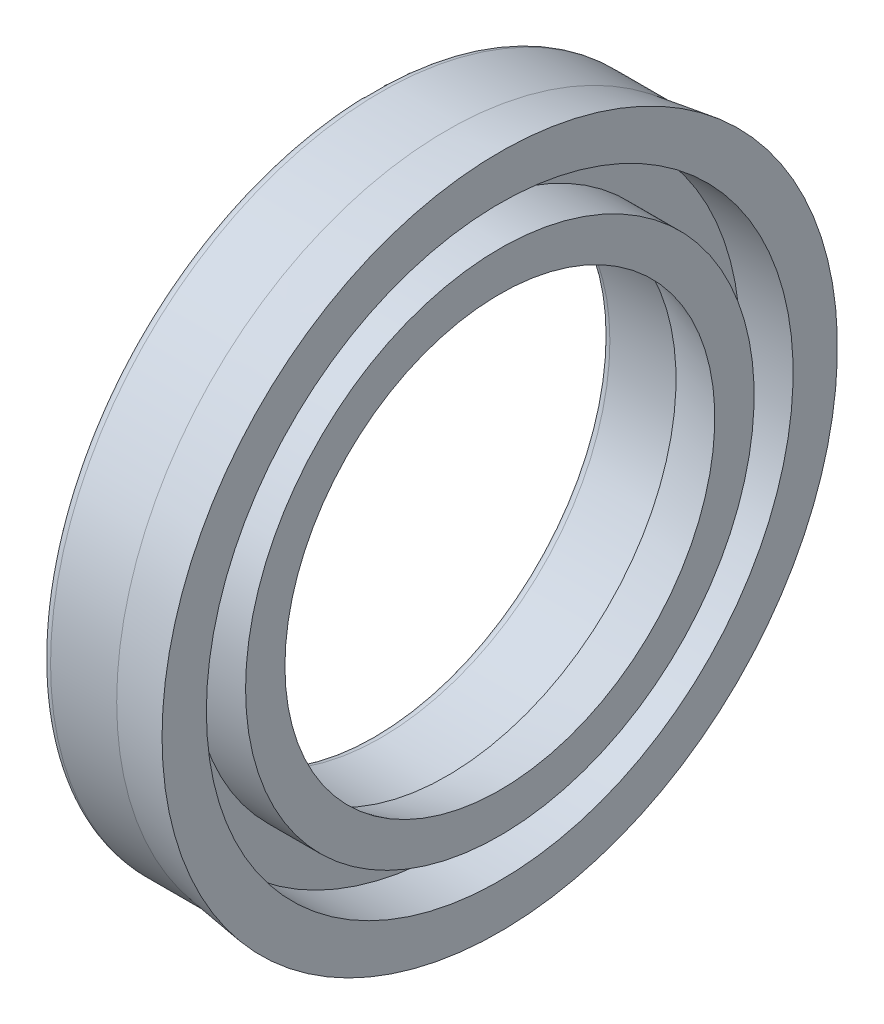
ISO-10303-21;
HEADER;
FILE_DESCRIPTION(('STEP AP214'),'2;1');
FILE_NAME('part.step','',(''),(''),'','','');
FILE_SCHEMA(('AUTOMOTIVE_DESIGN { 1 0 10303 214 1 1 1 1 }'));
ENDSEC;
DATA;
#1=APPLICATION_CONTEXT('core data for automotive mechanical design processes');
#2=APPLICATION_PROTOCOL_DEFINITION('international standard','automotive_design',2000,#1);
#3=PRODUCT_CONTEXT('',#1,'mechanical');
#4=PRODUCT('Part','Part','',(#3));
#5=PRODUCT_RELATED_PRODUCT_CATEGORY('part','',(#4));
#6=PRODUCT_DEFINITION_FORMATION('','',#4);
#7=PRODUCT_DEFINITION_CONTEXT('part definition',#1,'design');
#8=PRODUCT_DEFINITION('design','',#6,#7);
#9=PRODUCT_DEFINITION_SHAPE('','',#8);
#10=(LENGTH_UNIT() NAMED_UNIT(*) SI_UNIT(.MILLI.,.METRE.));
#11=(NAMED_UNIT(*) PLANE_ANGLE_UNIT() SI_UNIT($,.RADIAN.));
#12=(NAMED_UNIT(*) SI_UNIT($,.STERADIAN.) SOLID_ANGLE_UNIT());
#13=UNCERTAINTY_MEASURE_WITH_UNIT(LENGTH_MEASURE(1.E-05),#10,'distance_accuracy_value','');
#14=(GEOMETRIC_REPRESENTATION_CONTEXT(3) GLOBAL_UNCERTAINTY_ASSIGNED_CONTEXT((#13)) GLOBAL_UNIT_ASSIGNED_CONTEXT((#10,
#11,#12)) REPRESENTATION_CONTEXT('',''));
#15=CARTESIAN_POINT('',(0.,0.,0.));
#16=DIRECTION('',(0.,0.,1.));
#17=DIRECTION('',(1.,0.,0.));
#18=AXIS2_PLACEMENT_3D('',#15,#16,#17);
#19=CARTESIAN_POINT('',(0.,0.,0.));
#20=DIRECTION('',(-1.,0.,0.));
#21=DIRECTION('',(0.,0.,1.));
#22=AXIS2_PLACEMENT_3D('',#19,#20,#21);
#23=CYLINDRICAL_SURFACE('',#22,12.5);
#24=CARTESIAN_POINT('',(0.5,0.,0.));
#25=DIRECTION('',(1.,0.,0.));
#26=DIRECTION('',(0.,0.,-1.));
#27=AXIS2_PLACEMENT_3D('',#24,#25,#26);
#28=CIRCLE('',#27,12.5);
#29=CARTESIAN_POINT('',(0.5,0.,-12.5));
#30=VERTEX_POINT('',#29);
#31=EDGE_CURVE('E37',#30,#30,#28,.F.);
#32=ORIENTED_EDGE('',*,*,#31,.T.);
#33=EDGE_LOOP('',(#32));
#34=FACE_BOUND('',#33,.T.);
#35=CARTESIAN_POINT('',(4.10642547441009,0.,0.));
#36=DIRECTION('',(-1.,0.,0.));
#37=DIRECTION('',(0.,0.,1.));
#38=AXIS2_PLACEMENT_3D('',#35,#36,#37);
#39=CIRCLE('',#38,12.5);
#40=CARTESIAN_POINT('',(4.10642547441009,0.,12.5));
#41=VERTEX_POINT('',#40);
#42=EDGE_CURVE('E50',#41,#41,#39,.T.);
#43=ORIENTED_EDGE('',*,*,#42,.F.);
#44=EDGE_LOOP('',(#43));
#45=FACE_BOUND('',#44,.T.);
#46=ADVANCED_FACE('F30',(#34,#45),#23,.F.);
#47=CARTESIAN_POINT('',(4.10642547441009,0.,0.));
#48=DIRECTION('',(-1.,0.,0.));
#49=DIRECTION('',(0.,0.,1.));
#50=AXIS2_PLACEMENT_3D('',#47,#48,#49);
#51=CONICAL_SURFACE('',#50,12.5,0.263337938168541);
#52=CARTESIAN_POINT('',(7.,0.,0.));
#53=DIRECTION('',(-1.,0.,0.));
#54=DIRECTION('',(0.,0.,1.));
#55=AXIS2_PLACEMENT_3D('',#52,#53,#54);
#56=CIRCLE('',#55,11.7198955280417);
#57=CARTESIAN_POINT('',(7.,0.,11.7198955280417));
#58=VERTEX_POINT('',#57);
#59=EDGE_CURVE('E53',#58,#58,#56,.T.);
#60=ORIENTED_EDGE('',*,*,#59,.F.);
#61=EDGE_LOOP('',(#60));
#62=FACE_BOUND('',#61,.T.);
#63=ORIENTED_EDGE('',*,*,#42,.T.);
#64=EDGE_LOOP('',(#63));
#65=FACE_BOUND('',#64,.T.);
#66=ADVANCED_FACE('F110',(#62,#65),#51,.F.);
#67=CARTESIAN_POINT('',(7.,11.7198955280417,0.));
#68=DIRECTION('',(-1.,0.,0.));
#69=DIRECTION('',(0.,0.,1.));
#70=AXIS2_PLACEMENT_3D('',#67,#68,#69);
#71=PLANE('',#70);
#72=CARTESIAN_POINT('',(7.,0.,0.));
#73=DIRECTION('',(-1.,0.,0.));
#74=DIRECTION('',(0.,0.,1.));
#75=AXIS2_PLACEMENT_3D('',#72,#73,#74);
#76=CIRCLE('',#75,13.8658290824545);
#77=CARTESIAN_POINT('',(7.,0.,13.8658290824545));
#78=VERTEX_POINT('',#77);
#79=EDGE_CURVE('E56',#78,#78,#76,.T.);
#80=ORIENTED_EDGE('',*,*,#79,.F.);
#81=EDGE_LOOP('',(#80));
#82=FACE_BOUND('',#81,.T.);
#83=ORIENTED_EDGE('',*,*,#59,.T.);
#84=EDGE_LOOP('',(#83));
#85=FACE_BOUND('',#84,.T.);
#86=ADVANCED_FACE('F104',(#82,#85),#71,.F.);
#87=CARTESIAN_POINT('',(0.,0.,0.));
#88=DIRECTION('',(-1.,0.,0.));
#89=DIRECTION('',(0.,0.,1.));
#90=AXIS2_PLACEMENT_3D('',#87,#88,#89);
#91=CYLINDRICAL_SURFACE('',#90,13.8658290824545);
#92=CARTESIAN_POINT('',(4.10642547441009,0.,0.));
#93=DIRECTION('',(-1.,0.,0.));
#94=DIRECTION('',(0.,0.,1.));
#95=AXIS2_PLACEMENT_3D('',#92,#93,#94);
#96=CIRCLE('',#95,13.8658290824545);
#97=CARTESIAN_POINT('',(4.10642547441009,0.,13.8658290824545));
#98=VERTEX_POINT('',#97);
#99=EDGE_CURVE('E59',#98,#98,#96,.T.);
#100=ORIENTED_EDGE('',*,*,#99,.F.);
#101=EDGE_LOOP('',(#100));
#102=FACE_BOUND('',#101,.T.);
#103=ORIENTED_EDGE('',*,*,#79,.T.);
#104=EDGE_LOOP('',(#103));
#105=FACE_BOUND('',#104,.T.);
#106=ADVANCED_FACE('F98',(#102,#105),#91,.T.);
#107=CARTESIAN_POINT('',(4.10642547441009,13.8658290824545,0.));
#108=DIRECTION('',(-1.,0.,0.));
#109=DIRECTION('',(0.,0.,1.));
#110=AXIS2_PLACEMENT_3D('',#107,#108,#109);
#111=PLANE('',#110);
#112=CARTESIAN_POINT('',(4.10642547441009,0.,0.));
#113=DIRECTION('',(-1.,0.,0.));
#114=DIRECTION('',(0.,0.,1.));
#115=AXIS2_PLACEMENT_3D('',#112,#113,#114);
#116=CIRCLE('',#115,15.9974286234701);
#117=CARTESIAN_POINT('',(4.10642547441009,0.,15.9974286234701));
#118=VERTEX_POINT('',#117);
#119=EDGE_CURVE('E62',#118,#118,#116,.T.);
#120=ORIENTED_EDGE('',*,*,#119,.F.);
#121=EDGE_LOOP('',(#120));
#122=FACE_BOUND('',#121,.T.);
#123=ORIENTED_EDGE('',*,*,#99,.T.);
#124=EDGE_LOOP('',(#123));
#125=FACE_BOUND('',#124,.T.);
#126=ADVANCED_FACE('F92',(#122,#125),#111,.F.);
#127=CARTESIAN_POINT('',(0.,0.,0.));
#128=DIRECTION('',(-1.,0.,0.));
#129=DIRECTION('',(0.,0.,1.));
#130=AXIS2_PLACEMENT_3D('',#127,#128,#129);
#131=CYLINDRICAL_SURFACE('',#130,15.9974286234701);
#132=CARTESIAN_POINT('',(6.9936870698993,0.,0.));
#133=DIRECTION('',(-1.,0.,0.));
#134=DIRECTION('',(0.,0.,1.));
#135=AXIS2_PLACEMENT_3D('',#132,#133,#134);
#136=CIRCLE('',#135,15.9974286234701);
#137=CARTESIAN_POINT('',(6.9936870698993,0.,15.9974286234701));
#138=VERTEX_POINT('',#137);
#139=EDGE_CURVE('E65',#138,#138,#136,.T.);
#140=ORIENTED_EDGE('',*,*,#139,.F.);
#141=EDGE_LOOP('',(#140));
#142=FACE_BOUND('',#141,.T.);
#143=ORIENTED_EDGE('',*,*,#119,.T.);
#144=EDGE_LOOP('',(#143));
#145=FACE_BOUND('',#144,.T.);
#146=ADVANCED_FACE('F86',(#142,#145),#131,.F.);
#147=CARTESIAN_POINT('',(6.9936870698993,18.4139644623995,0.));
#148=DIRECTION('',(-1.,0.,0.));
#149=DIRECTION('',(0.,0.,1.));
#150=AXIS2_PLACEMENT_3D('',#147,#148,#149);
#151=PLANE('',#150);
#152=CARTESIAN_POINT('',(6.9936870698993,0.,0.));
#153=DIRECTION('',(-1.,0.,0.));
#154=DIRECTION('',(0.,0.,1.));
#155=AXIS2_PLACEMENT_3D('',#152,#153,#154);
#156=CIRCLE('',#155,18.4139644623995);
#157=CARTESIAN_POINT('',(6.9936870698993,0.,18.4139644623995));
#158=VERTEX_POINT('',#157);
#159=EDGE_CURVE('E68',#158,#158,#156,.T.);
#160=ORIENTED_EDGE('',*,*,#159,.F.);
#161=EDGE_LOOP('',(#160));
#162=FACE_BOUND('',#161,.T.);
#163=ORIENTED_EDGE('',*,*,#139,.T.);
#164=EDGE_LOOP('',(#163));
#165=FACE_BOUND('',#164,.T.);
#166=ADVANCED_FACE('F80',(#162,#165),#151,.F.);
#167=CARTESIAN_POINT('',(6.9936870698993,0.,0.));
#168=DIRECTION('',(1.,0.,0.));
#169=DIRECTION('',(0.,0.,-1.));
#170=AXIS2_PLACEMENT_3D('',#167,#168,#169);
#171=CONICAL_SURFACE('',#170,18.4139644623995,0.142405648269307);
#172=CARTESIAN_POINT('',(4.10642547441009,0.,0.));
#173=DIRECTION('',(-1.,0.,0.));
#174=DIRECTION('',(0.,0.,1.));
#175=AXIS2_PLACEMENT_3D('',#172,#173,#174);
#176=CIRCLE('',#175,18.);
#177=CARTESIAN_POINT('',(4.10642547441009,0.,18.));
#178=VERTEX_POINT('',#177);
#179=EDGE_CURVE('E71',#178,#178,#176,.T.);
#180=ORIENTED_EDGE('',*,*,#179,.F.);
#181=EDGE_LOOP('',(#180));
#182=FACE_BOUND('',#181,.T.);
#183=ORIENTED_EDGE('',*,*,#159,.T.);
#184=EDGE_LOOP('',(#183));
#185=FACE_BOUND('',#184,.T.);
#186=ADVANCED_FACE('F77',(#182,#185),#171,.T.);
#187=CARTESIAN_POINT('',(0.,0.,0.));
#188=DIRECTION('',(-1.,0.,0.));
#189=DIRECTION('',(0.,0.,1.));
#190=AXIS2_PLACEMENT_3D('',#187,#188,#189);
#191=CYLINDRICAL_SURFACE('',#190,18.);
#192=CARTESIAN_POINT('',(0.5,0.,0.));
#193=DIRECTION('',(1.,0.,0.));
#194=DIRECTION('',(0.,0.,-1.));
#195=AXIS2_PLACEMENT_3D('',#192,#193,#194);
#196=CIRCLE('',#195,18.);
#197=CARTESIAN_POINT('',(0.5,0.,-18.));
#198=VERTEX_POINT('',#197);
#199=EDGE_CURVE('E41',#198,#198,#196,.T.);
#200=ORIENTED_EDGE('',*,*,#199,.T.);
#201=EDGE_LOOP('',(#200));
#202=FACE_BOUND('',#201,.T.);
#203=ORIENTED_EDGE('',*,*,#179,.T.);
#204=EDGE_LOOP('',(#203));
#205=FACE_BOUND('',#204,.T.);
#206=ADVANCED_FACE('F75',(#202,#205),#191,.T.);
#207=CARTESIAN_POINT('',(0.,18.,0.));
#208=DIRECTION('',(1.,0.,0.));
#209=DIRECTION('',(0.,0.,-1.));
#210=AXIS2_PLACEMENT_3D('',#207,#208,#209);
#211=PLANE('',#210);
#212=CARTESIAN_POINT('',(0.,0.,0.));
#213=DIRECTION('',(1.,0.,0.));
#214=DIRECTION('',(0.,0.,-1.));
#215=AXIS2_PLACEMENT_3D('',#212,#213,#214);
#216=CIRCLE('',#215,13.);
#217=CARTESIAN_POINT('',(0.,0.,-13.));
#218=VERTEX_POINT('',#217);
#219=EDGE_CURVE('E10',#218,#218,#216,.T.);
#220=ORIENTED_EDGE('',*,*,#219,.T.);
#221=EDGE_LOOP('',(#220));
#222=FACE_BOUND('',#221,.T.);
#223=CARTESIAN_POINT('',(0.,0.,0.));
#224=DIRECTION('',(1.,0.,0.));
#225=DIRECTION('',(0.,0.,-1.));
#226=AXIS2_PLACEMENT_3D('',#223,#224,#225);
#227=CIRCLE('',#226,17.5);
#228=CARTESIAN_POINT('',(0.,0.,-17.5));
#229=VERTEX_POINT('',#228);
#230=EDGE_CURVE('E45',#229,#229,#227,.F.);
#231=ORIENTED_EDGE('',*,*,#230,.T.);
#232=EDGE_LOOP('',(#231));
#233=FACE_BOUND('',#232,.T.);
#234=ADVANCED_FACE('F125',(#222,#233),#211,.F.);
#235=CARTESIAN_POINT('',(0.5,0.,0.));
#236=DIRECTION('',(1.,0.,0.));
#237=DIRECTION('',(0.,0.,-1.));
#238=AXIS2_PLACEMENT_3D('',#235,#236,#237);
#239=TOROIDAL_SURFACE('',#238,17.5,0.5);
#240=ORIENTED_EDGE('',*,*,#199,.F.);
#241=EDGE_LOOP('',(#240));
#242=FACE_BOUND('',#241,.T.);
#243=ORIENTED_EDGE('',*,*,#230,.F.);
#244=EDGE_LOOP('',(#243));
#245=FACE_BOUND('',#244,.T.);
#246=ADVANCED_FACE('F123',(#242,#245),#239,.T.);
#247=CARTESIAN_POINT('',(0.5,0.,0.));
#248=DIRECTION('',(1.,0.,0.));
#249=DIRECTION('',(0.,0.,-1.));
#250=AXIS2_PLACEMENT_3D('',#247,#248,#249);
#251=TOROIDAL_SURFACE('',#250,13.,0.5);
#252=ORIENTED_EDGE('',*,*,#219,.F.);
#253=EDGE_LOOP('',(#252));
#254=FACE_BOUND('',#253,.T.);
#255=ORIENTED_EDGE('',*,*,#31,.F.);
#256=EDGE_LOOP('',(#255));
#257=FACE_BOUND('',#256,.T.);
#258=ADVANCED_FACE('F32',(#254,#257),#251,.T.);
#259=CLOSED_SHELL('',(#46,#66,#86,#106,#126,#146,#166,#186,#206,#234,#246,#258));
#260=MANIFOLD_SOLID_BREP('B2',#259);
#261=ADVANCED_BREP_SHAPE_REPRESENTATION('',(#18,#260),#14);
#262=SHAPE_DEFINITION_REPRESENTATION(#9,#261);
ENDSEC;
END-ISO-10303-21;
